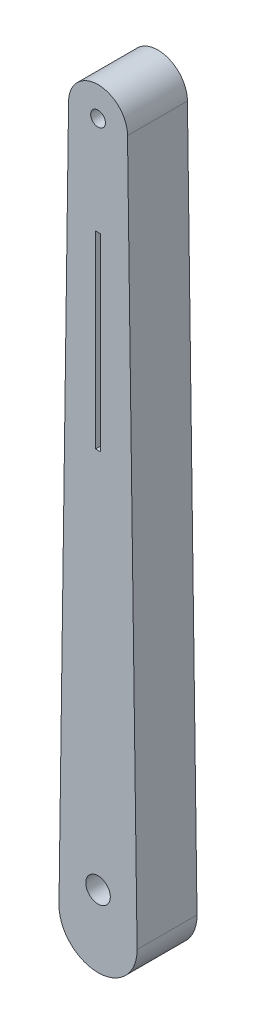
ISO-10303-21;
HEADER;
FILE_DESCRIPTION(('STEP AP214'),'2;1');
FILE_NAME('part.step','',(''),(''),'','','');
FILE_SCHEMA(('AUTOMOTIVE_DESIGN { 1 0 10303 214 1 1 1 1 }'));
ENDSEC;
DATA;
#1=APPLICATION_CONTEXT('core data for automotive mechanical design processes');
#2=APPLICATION_PROTOCOL_DEFINITION('international standard','automotive_design',2000,#1);
#3=PRODUCT_CONTEXT('',#1,'mechanical');
#4=PRODUCT('Part','Part','',(#3));
#5=PRODUCT_RELATED_PRODUCT_CATEGORY('part','',(#4));
#6=PRODUCT_DEFINITION_FORMATION('','',#4);
#7=PRODUCT_DEFINITION_CONTEXT('part definition',#1,'design');
#8=PRODUCT_DEFINITION('design','',#6,#7);
#9=PRODUCT_DEFINITION_SHAPE('','',#8);
#10=(LENGTH_UNIT() NAMED_UNIT(*) SI_UNIT(.MILLI.,.METRE.));
#11=(NAMED_UNIT(*) PLANE_ANGLE_UNIT() SI_UNIT($,.RADIAN.));
#12=(NAMED_UNIT(*) SI_UNIT($,.STERADIAN.) SOLID_ANGLE_UNIT());
#13=UNCERTAINTY_MEASURE_WITH_UNIT(LENGTH_MEASURE(1.E-05),#10,'distance_accuracy_value','');
#14=(GEOMETRIC_REPRESENTATION_CONTEXT(3) GLOBAL_UNCERTAINTY_ASSIGNED_CONTEXT((#13)) GLOBAL_UNIT_ASSIGNED_CONTEXT((#10,
#11,#12)) REPRESENTATION_CONTEXT('',''));
#15=CARTESIAN_POINT('',(0.,0.,0.));
#16=DIRECTION('',(0.,0.,1.));
#17=DIRECTION('',(1.,0.,0.));
#18=AXIS2_PLACEMENT_3D('',#15,#16,#17);
#19=CARTESIAN_POINT('',(0.,-72.,12.2));
#20=DIRECTION('',(0.,0.,1.));
#21=DIRECTION('',(1.,0.,0.));
#22=AXIS2_PLACEMENT_3D('',#19,#20,#21);
#23=PLANE('',#22);
#24=CARTESIAN_POINT('',(0.,-62.,12.2));
#25=DIRECTION('',(0.,0.,1.));
#26=DIRECTION('',(1.,0.,0.));
#27=AXIS2_PLACEMENT_3D('',#24,#25,#26);
#28=CIRCLE('',#27,2.5);
#29=CARTESIAN_POINT('',(2.5,-62.,12.2));
#30=VERTEX_POINT('',#29);
#31=EDGE_CURVE('E200',#30,#30,#28,.T.);
#32=ORIENTED_EDGE('',*,*,#31,.F.);
#33=EDGE_LOOP('',(#32));
#34=FACE_BOUND('',#33,.T.);
#35=CARTESIAN_POINT('',(0.,74.,12.2));
#36=DIRECTION('',(0.,0.,1.));
#37=DIRECTION('',(1.,0.,0.));
#38=AXIS2_PLACEMENT_3D('',#35,#36,#37);
#39=CIRCLE('',#38,1.5);
#40=CARTESIAN_POINT('',(1.5,74.,12.2));
#41=VERTEX_POINT('',#40);
#42=EDGE_CURVE('E192',#41,#41,#39,.T.);
#43=ORIENTED_EDGE('',*,*,#42,.F.);
#44=EDGE_LOOP('',(#43));
#45=FACE_BOUND('',#44,.T.);
#46=DIRECTION('',(-0.0136973450269747,-0.999906186969164,0.));
#47=VECTOR('',#46,1.);
#48=CARTESIAN_POINT('',(-7.99999999999997,-72.,12.2));
#49=LINE('',#48,#47);
#50=CARTESIAN_POINT('',(-6.,74.,12.2));
#51=VERTEX_POINT('',#50);
#52=CARTESIAN_POINT('',(-7.95263568856894,-68.5424052655344,12.2));
#53=VERTEX_POINT('',#52);
#54=EDGE_CURVE('E120',#51,#53,#49,.T.);
#55=ORIENTED_EDGE('',*,*,#54,.T.);
#56=CARTESIAN_POINT('',(0.,-68.6513454804463,12.2));
#57=DIRECTION('',(0.,0.,1.));
#58=DIRECTION('',(1.,0.,0.));
#59=AXIS2_PLACEMENT_3D('',#56,#57,#58);
#60=CIRCLE('',#59,7.95338181942282);
#61=CARTESIAN_POINT('',(7.95263568856894,-68.5424052655344,12.2));
#62=VERTEX_POINT('',#61);
#63=EDGE_CURVE('E63',#53,#62,#60,.T.);
#64=ORIENTED_EDGE('',*,*,#63,.T.);
#65=DIRECTION('',(-0.0136973450269747,0.999906186969164,0.));
#66=VECTOR('',#65,1.);
#67=CARTESIAN_POINT('',(7.99999999999997,-72.,12.2));
#68=LINE('',#67,#66);
#69=CARTESIAN_POINT('',(6.,74.,12.2));
#70=VERTEX_POINT('',#69);
#71=EDGE_CURVE('E127',#62,#70,#68,.T.);
#72=ORIENTED_EDGE('',*,*,#71,.T.);
#73=CARTESIAN_POINT('',(0.,74.,12.2));
#74=DIRECTION('',(0.,0.,1.));
#75=DIRECTION('',(1.,0.,0.));
#76=AXIS2_PLACEMENT_3D('',#73,#74,#75);
#77=CIRCLE('',#76,6.);
#78=EDGE_CURVE('E130',#70,#51,#77,.T.);
#79=ORIENTED_EDGE('',*,*,#78,.T.);
#80=EDGE_LOOP('',(#55,#64,#72,#79));
#81=FACE_BOUND('',#80,.T.);
#82=DIRECTION('',(1.,0.,0.));
#83=VECTOR('',#82,1.);
#84=CARTESIAN_POINT('',(0.,15.500176579713,12.2));
#85=LINE('',#84,#83);
#86=CARTESIAN_POINT('',(-0.5,15.500176579713,12.2));
#87=VERTEX_POINT('',#86);
#88=CARTESIAN_POINT('',(0.5,15.500176579713,12.2));
#89=VERTEX_POINT('',#88);
#90=EDGE_CURVE('E47',#87,#89,#85,.T.);
#91=ORIENTED_EDGE('',*,*,#90,.F.);
#92=DIRECTION('',(0.,1.,0.));
#93=VECTOR('',#92,1.);
#94=CARTESIAN_POINT('',(-0.5,-72.,12.2));
#95=LINE('',#94,#93);
#96=CARTESIAN_POINT('',(-0.5,53.9383947377914,12.2));
#97=VERTEX_POINT('',#96);
#98=EDGE_CURVE('E11',#87,#97,#95,.T.);
#99=ORIENTED_EDGE('',*,*,#98,.T.);
#100=DIRECTION('',(-1.,0.,0.));
#101=VECTOR('',#100,1.);
#102=CARTESIAN_POINT('',(0.,53.9383947377914,12.2));
#103=LINE('',#102,#101);
#104=CARTESIAN_POINT('',(0.5,53.9383947377914,12.2));
#105=VERTEX_POINT('',#104);
#106=EDGE_CURVE('E139',#105,#97,#103,.T.);
#107=ORIENTED_EDGE('',*,*,#106,.F.);
#108=DIRECTION('',(0.,1.,0.));
#109=VECTOR('',#108,1.);
#110=CARTESIAN_POINT('',(0.5,-72.,12.2));
#111=LINE('',#110,#109);
#112=EDGE_CURVE('E145',#89,#105,#111,.T.);
#113=ORIENTED_EDGE('',*,*,#112,.F.);
#114=EDGE_LOOP('',(#91,#99,#107,#113));
#115=FACE_BOUND('',#114,.T.);
#116=ADVANCED_FACE('F38',(#34,#45,#81,#115),#23,.T.);
#117=CARTESIAN_POINT('',(0.,-72.,0.));
#118=DIRECTION('',(0.,0.,1.));
#119=DIRECTION('',(1.,0.,0.));
#120=AXIS2_PLACEMENT_3D('',#117,#118,#119);
#121=PLANE('',#120);
#122=CARTESIAN_POINT('',(0.,74.,0.));
#123=DIRECTION('',(0.,0.,1.));
#124=DIRECTION('',(1.,0.,0.));
#125=AXIS2_PLACEMENT_3D('',#122,#123,#124);
#126=CIRCLE('',#125,1.5);
#127=CARTESIAN_POINT('',(1.5,74.,0.));
#128=VERTEX_POINT('',#127);
#129=EDGE_CURVE('E142',#128,#128,#126,.T.);
#130=ORIENTED_EDGE('',*,*,#129,.T.);
#131=EDGE_LOOP('',(#130));
#132=FACE_BOUND('',#131,.T.);
#133=CARTESIAN_POINT('',(0.,-62.,0.));
#134=DIRECTION('',(0.,0.,1.));
#135=DIRECTION('',(1.,0.,0.));
#136=AXIS2_PLACEMENT_3D('',#133,#134,#135);
#137=CIRCLE('',#136,2.5);
#138=CARTESIAN_POINT('',(2.5,-62.,0.));
#139=VERTEX_POINT('',#138);
#140=EDGE_CURVE('E196',#139,#139,#137,.T.);
#141=ORIENTED_EDGE('',*,*,#140,.T.);
#142=EDGE_LOOP('',(#141));
#143=FACE_BOUND('',#142,.T.);
#144=CARTESIAN_POINT('',(0.,-68.6513454804463,0.));
#145=DIRECTION('',(0.,0.,1.));
#146=DIRECTION('',(1.,0.,0.));
#147=AXIS2_PLACEMENT_3D('',#144,#145,#146);
#148=CIRCLE('',#147,7.95338181942282);
#149=CARTESIAN_POINT('',(-7.95263568856894,-68.5424052655344,0.));
#150=VERTEX_POINT('',#149);
#151=CARTESIAN_POINT('',(7.95263568856894,-68.5424052655344,0.));
#152=VERTEX_POINT('',#151);
#153=EDGE_CURVE('E125',#150,#152,#148,.T.);
#154=ORIENTED_EDGE('',*,*,#153,.F.);
#155=DIRECTION('',(-0.0136973450269747,-0.999906186969164,0.));
#156=VECTOR('',#155,1.);
#157=CARTESIAN_POINT('',(-7.99999999999997,-72.,0.));
#158=LINE('',#157,#156);
#159=CARTESIAN_POINT('',(-6.,74.,0.));
#160=VERTEX_POINT('',#159);
#161=EDGE_CURVE('E114',#160,#150,#158,.T.);
#162=ORIENTED_EDGE('',*,*,#161,.F.);
#163=CARTESIAN_POINT('',(0.,74.,0.));
#164=DIRECTION('',(0.,0.,1.));
#165=DIRECTION('',(1.,0.,0.));
#166=AXIS2_PLACEMENT_3D('',#163,#164,#165);
#167=CIRCLE('',#166,6.);
#168=CARTESIAN_POINT('',(6.,74.,0.));
#169=VERTEX_POINT('',#168);
#170=EDGE_CURVE('E104',#169,#160,#167,.T.);
#171=ORIENTED_EDGE('',*,*,#170,.F.);
#172=DIRECTION('',(-0.0136973450269747,0.999906186969164,0.));
#173=VECTOR('',#172,1.);
#174=CARTESIAN_POINT('',(7.99999999999997,-72.,0.));
#175=LINE('',#174,#173);
#176=EDGE_CURVE('E98',#152,#169,#175,.T.);
#177=ORIENTED_EDGE('',*,*,#176,.F.);
#178=EDGE_LOOP('',(#154,#162,#171,#177));
#179=FACE_BOUND('',#178,.T.);
#180=ADVANCED_FACE('F124',(#132,#143,#179),#121,.F.);
#181=CARTESIAN_POINT('',(7.99999999999997,-72.,12.2));
#182=DIRECTION('',(-0.999906186969164,-0.0136973450269747,0.));
#183=DIRECTION('',(0.0136973450269747,-0.999906186969164,0.));
#184=AXIS2_PLACEMENT_3D('',#181,#182,#183);
#185=PLANE('',#184);
#186=DIRECTION('',(0.,0.,1.));
#187=VECTOR('',#186,1.);
#188=CARTESIAN_POINT('',(7.95263568856894,-68.5424052655344,-47.8));
#189=LINE('',#188,#187);
#190=EDGE_CURVE('E76',#152,#62,#189,.T.);
#191=ORIENTED_EDGE('',*,*,#190,.F.);
#192=ORIENTED_EDGE('',*,*,#176,.T.);
#193=DIRECTION('',(0.,0.,-1.));
#194=VECTOR('',#193,1.);
#195=CARTESIAN_POINT('',(6.,74.,12.2));
#196=LINE('',#195,#194);
#197=EDGE_CURVE('E110',#70,#169,#196,.T.);
#198=ORIENTED_EDGE('',*,*,#197,.F.);
#199=ORIENTED_EDGE('',*,*,#71,.F.);
#200=EDGE_LOOP('',(#191,#192,#198,#199));
#201=FACE_BOUND('',#200,.T.);
#202=ADVANCED_FACE('F40',(#201),#185,.F.);
#203=CARTESIAN_POINT('',(0.,74.,12.2));
#204=DIRECTION('',(0.,0.,-1.));
#205=DIRECTION('',(-1.,0.,0.));
#206=AXIS2_PLACEMENT_3D('',#203,#204,#205);
#207=CYLINDRICAL_SURFACE('',#206,6.);
#208=ORIENTED_EDGE('',*,*,#170,.T.);
#209=DIRECTION('',(0.,0.,-1.));
#210=VECTOR('',#209,1.);
#211=CARTESIAN_POINT('',(-6.,74.,12.2));
#212=LINE('',#211,#210);
#213=EDGE_CURVE('E108',#51,#160,#212,.T.);
#214=ORIENTED_EDGE('',*,*,#213,.F.);
#215=ORIENTED_EDGE('',*,*,#78,.F.);
#216=ORIENTED_EDGE('',*,*,#197,.T.);
#217=EDGE_LOOP('',(#208,#214,#215,#216));
#218=FACE_BOUND('',#217,.T.);
#219=ADVANCED_FACE('F106',(#218),#207,.T.);
#220=CARTESIAN_POINT('',(-7.99999999999997,-72.,12.2));
#221=DIRECTION('',(0.999906186969164,-0.0136973450269747,0.));
#222=DIRECTION('',(0.0136973450269747,0.999906186969164,0.));
#223=AXIS2_PLACEMENT_3D('',#220,#221,#222);
#224=PLANE('',#223);
#225=ORIENTED_EDGE('',*,*,#161,.T.);
#226=DIRECTION('',(0.,0.,1.));
#227=VECTOR('',#226,1.);
#228=CARTESIAN_POINT('',(-7.95263568856894,-68.5424052655344,-47.8));
#229=LINE('',#228,#227);
#230=EDGE_CURVE('E136',#150,#53,#229,.T.);
#231=ORIENTED_EDGE('',*,*,#230,.T.);
#232=ORIENTED_EDGE('',*,*,#54,.F.);
#233=ORIENTED_EDGE('',*,*,#213,.T.);
#234=EDGE_LOOP('',(#225,#231,#232,#233));
#235=FACE_BOUND('',#234,.T.);
#236=ADVANCED_FACE('F118',(#235),#224,.F.);
#237=CARTESIAN_POINT('',(0.,-62.,12.2));
#238=DIRECTION('',(0.,0.,-1.));
#239=DIRECTION('',(-1.,0.,0.));
#240=AXIS2_PLACEMENT_3D('',#237,#238,#239);
#241=CYLINDRICAL_SURFACE('',#240,2.5);
#242=ORIENTED_EDGE('',*,*,#31,.T.);
#243=EDGE_LOOP('',(#242));
#244=FACE_BOUND('',#243,.T.);
#245=ORIENTED_EDGE('',*,*,#140,.F.);
#246=EDGE_LOOP('',(#245));
#247=FACE_BOUND('',#246,.T.);
#248=ADVANCED_FACE('F230',(#244,#247),#241,.F.);
#249=CARTESIAN_POINT('',(0.,74.,12.2));
#250=DIRECTION('',(0.,0.,-1.));
#251=DIRECTION('',(-1.,0.,0.));
#252=AXIS2_PLACEMENT_3D('',#249,#250,#251);
#253=CYLINDRICAL_SURFACE('',#252,1.5);
#254=ORIENTED_EDGE('',*,*,#42,.T.);
#255=EDGE_LOOP('',(#254));
#256=FACE_BOUND('',#255,.T.);
#257=ORIENTED_EDGE('',*,*,#129,.F.);
#258=EDGE_LOOP('',(#257));
#259=FACE_BOUND('',#258,.T.);
#260=ADVANCED_FACE('F237',(#256,#259),#253,.F.);
#261=CARTESIAN_POINT('',(0.,-68.6513454804463,-47.8));
#262=DIRECTION('',(0.,0.,1.));
#263=DIRECTION('',(1.,0.,0.));
#264=AXIS2_PLACEMENT_3D('',#261,#262,#263);
#265=CYLINDRICAL_SURFACE('',#264,7.95338181942282);
#266=ORIENTED_EDGE('',*,*,#230,.F.);
#267=ORIENTED_EDGE('',*,*,#153,.T.);
#268=ORIENTED_EDGE('',*,*,#190,.T.);
#269=ORIENTED_EDGE('',*,*,#63,.F.);
#270=EDGE_LOOP('',(#266,#267,#268,#269));
#271=FACE_BOUND('',#270,.T.);
#272=ADVANCED_FACE('F242',(#271),#265,.T.);
#273=CARTESIAN_POINT('',(-0.5,53.9383947377914,12.200012));
#274=DIRECTION('',(1.,0.,0.));
#275=DIRECTION('',(0.,0.,-1.));
#276=AXIS2_PLACEMENT_3D('',#273,#274,#275);
#277=PLANE('',#276);
#278=DIRECTION('',(0.,0.,-1.));
#279=VECTOR('',#278,1.);
#280=CARTESIAN_POINT('',(-0.5,15.500176579713,12.200012));
#281=LINE('',#280,#279);
#282=CARTESIAN_POINT('',(-0.5,15.500176579713,2.2));
#283=VERTEX_POINT('',#282);
#284=EDGE_CURVE('E157',#87,#283,#281,.T.);
#285=ORIENTED_EDGE('',*,*,#284,.T.);
#286=DIRECTION('',(0.,1.,0.));
#287=VECTOR('',#286,1.);
#288=CARTESIAN_POINT('',(-0.5,53.9383947377914,2.2));
#289=LINE('',#288,#287);
#290=CARTESIAN_POINT('',(-0.5,53.9383947377914,2.2));
#291=VERTEX_POINT('',#290);
#292=EDGE_CURVE('E176',#291,#283,#289,.F.);
#293=ORIENTED_EDGE('',*,*,#292,.F.);
#294=DIRECTION('',(0.,0.,-1.));
#295=VECTOR('',#294,1.);
#296=CARTESIAN_POINT('',(-0.5,53.9383947377914,12.200012));
#297=LINE('',#296,#295);
#298=EDGE_CURVE('E171',#97,#291,#297,.T.);
#299=ORIENTED_EDGE('',*,*,#298,.F.);
#300=ORIENTED_EDGE('',*,*,#98,.F.);
#301=EDGE_LOOP('',(#285,#293,#299,#300));
#302=FACE_BOUND('',#301,.T.);
#303=ADVANCED_FACE('F174',(#302),#277,.T.);
#304=CARTESIAN_POINT('',(0.5,15.500176579713,12.200012));
#305=DIRECTION('',(0.,-1.,0.));
#306=DIRECTION('',(0.,0.,-1.));
#307=AXIS2_PLACEMENT_3D('',#304,#305,#306);
#308=PLANE('',#307);
#309=ORIENTED_EDGE('',*,*,#90,.T.);
#310=DIRECTION('',(0.,0.,-1.));
#311=VECTOR('',#310,1.);
#312=CARTESIAN_POINT('',(0.5,15.500176579713,12.200012));
#313=LINE('',#312,#311);
#314=CARTESIAN_POINT('',(0.5,15.500176579713,2.2));
#315=VERTEX_POINT('',#314);
#316=EDGE_CURVE('E155',#89,#315,#313,.T.);
#317=ORIENTED_EDGE('',*,*,#316,.T.);
#318=DIRECTION('',(-1.,0.,0.));
#319=VECTOR('',#318,1.);
#320=CARTESIAN_POINT('',(0.5,15.500176579713,2.2));
#321=LINE('',#320,#319);
#322=EDGE_CURVE('E267',#315,#283,#321,.T.);
#323=ORIENTED_EDGE('',*,*,#322,.T.);
#324=ORIENTED_EDGE('',*,*,#284,.F.);
#325=EDGE_LOOP('',(#309,#317,#323,#324));
#326=FACE_BOUND('',#325,.T.);
#327=ADVANCED_FACE('F152',(#326),#308,.F.);
#328=CARTESIAN_POINT('',(0.5,53.9383947377914,12.200012));
#329=DIRECTION('',(1.,0.,0.));
#330=DIRECTION('',(0.,0.,-1.));
#331=AXIS2_PLACEMENT_3D('',#328,#329,#330);
#332=PLANE('',#331);
#333=ORIENTED_EDGE('',*,*,#112,.T.);
#334=DIRECTION('',(0.,0.,-1.));
#335=VECTOR('',#334,1.);
#336=CARTESIAN_POINT('',(0.5,53.9383947377914,12.200012));
#337=LINE('',#336,#335);
#338=CARTESIAN_POINT('',(0.5,53.9383947377914,2.2));
#339=VERTEX_POINT('',#338);
#340=EDGE_CURVE('E54',#105,#339,#337,.T.);
#341=ORIENTED_EDGE('',*,*,#340,.T.);
#342=DIRECTION('',(0.,1.,0.));
#343=VECTOR('',#342,1.);
#344=CARTESIAN_POINT('',(0.5,53.9383947377914,2.2));
#345=LINE('',#344,#343);
#346=EDGE_CURVE('E164',#339,#315,#345,.F.);
#347=ORIENTED_EDGE('',*,*,#346,.T.);
#348=ORIENTED_EDGE('',*,*,#316,.F.);
#349=EDGE_LOOP('',(#333,#341,#347,#348));
#350=FACE_BOUND('',#349,.T.);
#351=ADVANCED_FACE('F161',(#350),#332,.F.);
#352=CARTESIAN_POINT('',(-0.5,53.9383947377914,12.200012));
#353=DIRECTION('',(0.,1.,0.));
#354=DIRECTION('',(0.,0.,1.));
#355=AXIS2_PLACEMENT_3D('',#352,#353,#354);
#356=PLANE('',#355);
#357=ORIENTED_EDGE('',*,*,#106,.T.);
#358=ORIENTED_EDGE('',*,*,#298,.T.);
#359=DIRECTION('',(1.,0.,0.));
#360=VECTOR('',#359,1.);
#361=CARTESIAN_POINT('',(-0.5,53.9383947377914,2.2));
#362=LINE('',#361,#360);
#363=EDGE_CURVE('E178',#291,#339,#362,.T.);
#364=ORIENTED_EDGE('',*,*,#363,.T.);
#365=ORIENTED_EDGE('',*,*,#340,.F.);
#366=EDGE_LOOP('',(#357,#358,#364,#365));
#367=FACE_BOUND('',#366,.T.);
#368=ADVANCED_FACE('F169',(#367),#356,.F.);
#369=CARTESIAN_POINT('',(0.,0.,2.2));
#370=DIRECTION('',(0.,0.,1.));
#371=DIRECTION('',(1.,0.,0.));
#372=AXIS2_PLACEMENT_3D('',#369,#370,#371);
#373=PLANE('',#372);
#374=ORIENTED_EDGE('',*,*,#292,.T.);
#375=ORIENTED_EDGE('',*,*,#322,.F.);
#376=ORIENTED_EDGE('',*,*,#346,.F.);
#377=ORIENTED_EDGE('',*,*,#363,.F.);
#378=EDGE_LOOP('',(#374,#375,#376,#377));
#379=FACE_BOUND('',#378,.T.);
#380=ADVANCED_FACE('F261',(#379),#373,.T.);
#381=CLOSED_SHELL('',(#116,#180,#202,#219,#236,#248,#260,#272,#303,#327,#351,#368,#380));
#382=MANIFOLD_SOLID_BREP('B2',#381);
#383=ADVANCED_BREP_SHAPE_REPRESENTATION('',(#18,#382),#14);
#384=SHAPE_DEFINITION_REPRESENTATION(#9,#383);
ENDSEC;
END-ISO-10303-21;
